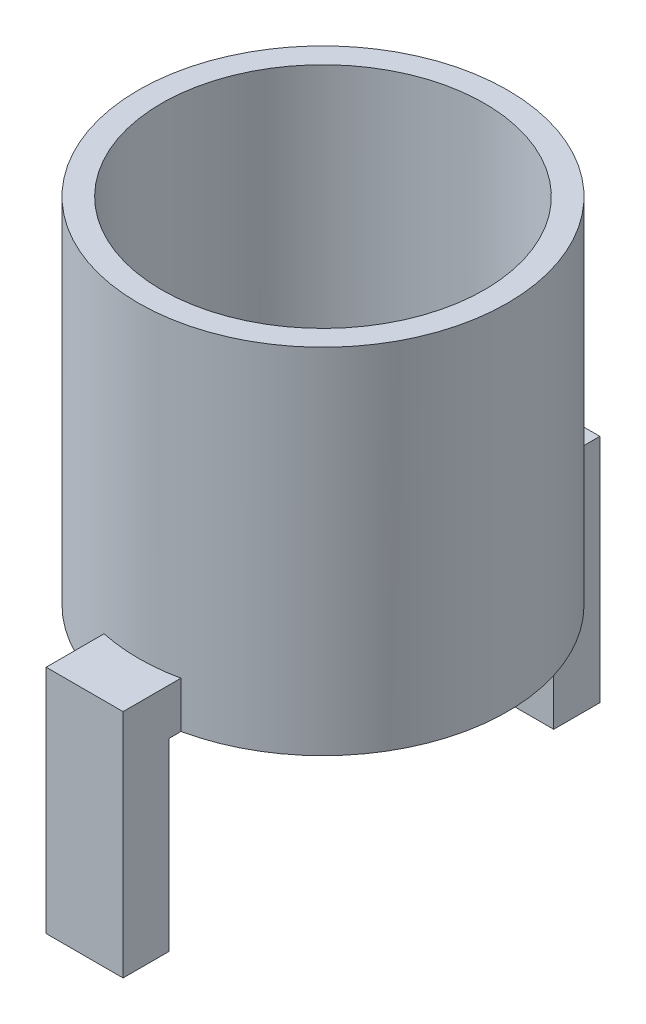
ISO-10303-21;
HEADER;
FILE_DESCRIPTION(('STEP AP214'),'2;1');
FILE_NAME('part.step','',(''),(''),'','','');
FILE_SCHEMA(('AUTOMOTIVE_DESIGN { 1 0 10303 214 1 1 1 1 }'));
ENDSEC;
DATA;
#1=APPLICATION_CONTEXT('core data for automotive mechanical design processes');
#2=APPLICATION_PROTOCOL_DEFINITION('international standard','automotive_design',2000,#1);
#3=PRODUCT_CONTEXT('',#1,'mechanical');
#4=PRODUCT('Part','Part','',(#3));
#5=PRODUCT_RELATED_PRODUCT_CATEGORY('part','',(#4));
#6=PRODUCT_DEFINITION_FORMATION('','',#4);
#7=PRODUCT_DEFINITION_CONTEXT('part definition',#1,'design');
#8=PRODUCT_DEFINITION('design','',#6,#7);
#9=PRODUCT_DEFINITION_SHAPE('','',#8);
#10=(LENGTH_UNIT() NAMED_UNIT(*) SI_UNIT(.MILLI.,.METRE.));
#11=(NAMED_UNIT(*) PLANE_ANGLE_UNIT() SI_UNIT($,.RADIAN.));
#12=(NAMED_UNIT(*) SI_UNIT($,.STERADIAN.) SOLID_ANGLE_UNIT());
#13=UNCERTAINTY_MEASURE_WITH_UNIT(LENGTH_MEASURE(1.E-05),#10,'distance_accuracy_value','');
#14=(GEOMETRIC_REPRESENTATION_CONTEXT(3) GLOBAL_UNCERTAINTY_ASSIGNED_CONTEXT((#13)) GLOBAL_UNIT_ASSIGNED_CONTEXT((#10,
#11,#12)) REPRESENTATION_CONTEXT('',''));
#15=CARTESIAN_POINT('',(0.,0.,0.));
#16=DIRECTION('',(0.,0.,1.));
#17=DIRECTION('',(1.,0.,0.));
#18=AXIS2_PLACEMENT_3D('',#15,#16,#17);
#19=CARTESIAN_POINT('',(-2.5,15.,15.5));
#20=DIRECTION('',(1.,0.,0.));
#21=DIRECTION('',(0.,0.,-1.));
#22=AXIS2_PLACEMENT_3D('',#19,#20,#21);
#23=PLANE('',#22);
#24=DIRECTION('',(0.,0.,-1.));
#25=VECTOR('',#24,1.);
#26=CARTESIAN_POINT('',(-2.5,11.995167951052,15.5));
#27=LINE('',#26,#25);
#28=CARTESIAN_POINT('',(-2.5,11.995167951052,-10.1980390271856));
#29=VERTEX_POINT('',#28);
#30=CARTESIAN_POINT('',(-2.5,11.995167951052,-12.5));
#31=VERTEX_POINT('',#30);
#32=EDGE_CURVE('E250',#29,#31,#27,.T.);
#33=ORIENTED_EDGE('',*,*,#32,.F.);
#34=DIRECTION('',(0.,1.,0.));
#35=VECTOR('',#34,1.);
#36=CARTESIAN_POINT('',(-2.5,10.,-10.1980390271856));
#37=LINE('',#36,#35);
#38=CARTESIAN_POINT('',(-2.5,12.,-10.1980390271856));
#39=VERTEX_POINT('',#38);
#40=EDGE_CURVE('E334',#29,#39,#37,.T.);
#41=ORIENTED_EDGE('',*,*,#40,.T.);
#42=DIRECTION('',(0.,0.,1.));
#43=VECTOR('',#42,1.);
#44=CARTESIAN_POINT('',(-2.5,12.,15.5));
#45=LINE('',#44,#43);
#46=CARTESIAN_POINT('',(-2.5,12.,-11.7366945943055));
#47=VERTEX_POINT('',#46);
#48=EDGE_CURVE('E206',#47,#39,#45,.T.);
#49=ORIENTED_EDGE('',*,*,#48,.F.);
#50=DIRECTION('',(0.,1.,0.));
#51=VECTOR('',#50,1.);
#52=CARTESIAN_POINT('',(-2.5,12.,-11.7366945943055));
#53=LINE('',#52,#51);
#54=CARTESIAN_POINT('',(-2.5,15.,-11.7366945943055));
#55=VERTEX_POINT('',#54);
#56=EDGE_CURVE('E203',#47,#55,#53,.T.);
#57=ORIENTED_EDGE('',*,*,#56,.T.);
#58=DIRECTION('',(0.,0.,1.));
#59=VECTOR('',#58,1.);
#60=CARTESIAN_POINT('',(-2.5,15.,15.5));
#61=LINE('',#60,#59);
#62=CARTESIAN_POINT('',(-2.5,15.,-15.5));
#63=VERTEX_POINT('',#62);
#64=EDGE_CURVE('E256',#63,#55,#61,.T.);
#65=ORIENTED_EDGE('',*,*,#64,.F.);
#66=DIRECTION('',(0.,-1.,0.));
#67=VECTOR('',#66,1.);
#68=CARTESIAN_POINT('',(-2.5,15.,-15.5));
#69=LINE('',#68,#67);
#70=CARTESIAN_POINT('',(-2.5,0.,-15.5));
#71=VERTEX_POINT('',#70);
#72=EDGE_CURVE('E214',#63,#71,#69,.T.);
#73=ORIENTED_EDGE('',*,*,#72,.T.);
#74=DIRECTION('',(0.,0.,1.));
#75=VECTOR('',#74,1.);
#76=CARTESIAN_POINT('',(-2.5,0.,-12.5));
#77=LINE('',#76,#75);
#78=CARTESIAN_POINT('',(-2.5,0.,-12.5));
#79=VERTEX_POINT('',#78);
#80=EDGE_CURVE('E229',#71,#79,#77,.T.);
#81=ORIENTED_EDGE('',*,*,#80,.T.);
#82=DIRECTION('',(0.,-1.,0.));
#83=VECTOR('',#82,1.);
#84=CARTESIAN_POINT('',(-2.5,15.,-12.5));
#85=LINE('',#84,#83);
#86=EDGE_CURVE('E218',#31,#79,#85,.T.);
#87=ORIENTED_EDGE('',*,*,#86,.F.);
#88=EDGE_LOOP('',(#33,#41,#49,#57,#65,#73,#81,#87));
#89=FACE_BOUND('',#88,.T.);
#90=ADVANCED_FACE('F45',(#89),#23,.F.);
#91=CARTESIAN_POINT('',(2.5,15.,15.5));
#92=DIRECTION('',(-1.,0.,0.));
#93=DIRECTION('',(0.,0.,1.));
#94=AXIS2_PLACEMENT_3D('',#91,#92,#93);
#95=PLANE('',#94);
#96=DIRECTION('',(0.,0.,-1.));
#97=VECTOR('',#96,1.);
#98=CARTESIAN_POINT('',(2.5,11.995167951052,15.5));
#99=LINE('',#98,#97);
#100=CARTESIAN_POINT('',(2.5,11.995167951052,12.5));
#101=VERTEX_POINT('',#100);
#102=CARTESIAN_POINT('',(2.5,11.995167951052,10.1980390271856));
#103=VERTEX_POINT('',#102);
#104=EDGE_CURVE('E174',#101,#103,#99,.T.);
#105=ORIENTED_EDGE('',*,*,#104,.T.);
#106=DIRECTION('',(0.,1.,0.));
#107=VECTOR('',#106,1.);
#108=CARTESIAN_POINT('',(2.5,10.,10.1980390271856));
#109=LINE('',#108,#107);
#110=CARTESIAN_POINT('',(2.5,12.,10.1980390271856));
#111=VERTEX_POINT('',#110);
#112=EDGE_CURVE('E161',#103,#111,#109,.T.);
#113=ORIENTED_EDGE('',*,*,#112,.T.);
#114=DIRECTION('',(0.,0.,-1.));
#115=VECTOR('',#114,1.);
#116=CARTESIAN_POINT('',(2.5,12.,15.5));
#117=LINE('',#116,#115);
#118=CARTESIAN_POINT('',(2.5,12.,11.7366945943055));
#119=VERTEX_POINT('',#118);
#120=EDGE_CURVE('E11',#119,#111,#117,.T.);
#121=ORIENTED_EDGE('',*,*,#120,.F.);
#122=DIRECTION('',(0.,1.,0.));
#123=VECTOR('',#122,1.);
#124=CARTESIAN_POINT('',(2.5,12.,11.7366945943055));
#125=LINE('',#124,#123);
#126=CARTESIAN_POINT('',(2.5,15.,11.7366945943055));
#127=VERTEX_POINT('',#126);
#128=EDGE_CURVE('E186',#119,#127,#125,.T.);
#129=ORIENTED_EDGE('',*,*,#128,.T.);
#130=DIRECTION('',(0.,0.,-1.));
#131=VECTOR('',#130,1.);
#132=CARTESIAN_POINT('',(2.5,15.,15.5));
#133=LINE('',#132,#131);
#134=CARTESIAN_POINT('',(2.5,15.,15.5));
#135=VERTEX_POINT('',#134);
#136=EDGE_CURVE('E265',#135,#127,#133,.T.);
#137=ORIENTED_EDGE('',*,*,#136,.F.);
#138=DIRECTION('',(0.,-1.,0.));
#139=VECTOR('',#138,1.);
#140=CARTESIAN_POINT('',(2.5,15.,15.5));
#141=LINE('',#140,#139);
#142=CARTESIAN_POINT('',(2.5,0.,15.5));
#143=VERTEX_POINT('',#142);
#144=EDGE_CURVE('E289',#135,#143,#141,.T.);
#145=ORIENTED_EDGE('',*,*,#144,.T.);
#146=DIRECTION('',(0.,0.,-1.));
#147=VECTOR('',#146,1.);
#148=CARTESIAN_POINT('',(2.5,0.,15.5));
#149=LINE('',#148,#147);
#150=CARTESIAN_POINT('',(2.5,0.,12.5));
#151=VERTEX_POINT('',#150);
#152=EDGE_CURVE('E276',#143,#151,#149,.T.);
#153=ORIENTED_EDGE('',*,*,#152,.T.);
#154=DIRECTION('',(0.,-1.,0.));
#155=VECTOR('',#154,1.);
#156=CARTESIAN_POINT('',(2.5,15.,12.5));
#157=LINE('',#156,#155);
#158=EDGE_CURVE('E286',#101,#151,#157,.T.);
#159=ORIENTED_EDGE('',*,*,#158,.F.);
#160=EDGE_LOOP('',(#105,#113,#121,#129,#137,#145,#153,#159));
#161=FACE_BOUND('',#160,.T.);
#162=ADVANCED_FACE('F170',(#161),#95,.F.);
#163=CARTESIAN_POINT('',(-2.5,11.995167951052,15.5));
#164=DIRECTION('',(0.,1.,0.));
#165=DIRECTION('',(0.,0.,1.));
#166=AXIS2_PLACEMENT_3D('',#163,#164,#165);
#167=PLANE('',#166);
#168=CARTESIAN_POINT('',(2.5,11.995167951052,-10.1980390271856));
#169=VERTEX_POINT('',#168);
#170=CARTESIAN_POINT('',(2.5,11.995167951052,-12.5));
#171=VERTEX_POINT('',#170);
#172=EDGE_CURVE('E247',#169,#171,#99,.T.);
#173=ORIENTED_EDGE('',*,*,#172,.F.);
#174=CARTESIAN_POINT('',(0.,11.995167951052,0.));
#175=DIRECTION('',(0.,1.,0.));
#176=DIRECTION('',(0.,0.,1.));
#177=AXIS2_PLACEMENT_3D('',#174,#175,#176);
#178=CIRCLE('',#177,10.5);
#179=EDGE_CURVE('E331',#169,#29,#178,.T.);
#180=ORIENTED_EDGE('',*,*,#179,.T.);
#181=ORIENTED_EDGE('',*,*,#32,.T.);
#182=DIRECTION('',(1.,0.,0.));
#183=VECTOR('',#182,1.);
#184=CARTESIAN_POINT('',(-2.5,11.995167951052,-12.5));
#185=LINE('',#184,#183);
#186=EDGE_CURVE('E240',#31,#171,#185,.T.);
#187=ORIENTED_EDGE('',*,*,#186,.T.);
#188=EDGE_LOOP('',(#173,#180,#181,#187));
#189=FACE_BOUND('',#188,.T.);
#190=ADVANCED_FACE('F329',(#189),#167,.F.);
#191=CARTESIAN_POINT('',(0.,15.,0.));
#192=DIRECTION('',(0.,1.,0.));
#193=DIRECTION('',(0.,0.,1.));
#194=AXIS2_PLACEMENT_3D('',#191,#192,#193);
#195=PLANE('',#194);
#196=CARTESIAN_POINT('',(0.,15.,0.));
#197=DIRECTION('',(0.,1.,0.));
#198=DIRECTION('',(0.,0.,1.));
#199=AXIS2_PLACEMENT_3D('',#196,#197,#198);
#200=CIRCLE('',#199,12.);
#201=CARTESIAN_POINT('',(2.5,15.,-11.7366945943055));
#202=VERTEX_POINT('',#201);
#203=EDGE_CURVE('E300',#202,#55,#200,.T.);
#204=ORIENTED_EDGE('',*,*,#203,.F.);
#205=CARTESIAN_POINT('',(2.5,15.,-15.5));
#206=VERTEX_POINT('',#205);
#207=EDGE_CURVE('E264',#202,#206,#133,.T.);
#208=ORIENTED_EDGE('',*,*,#207,.T.);
#209=DIRECTION('',(-1.,0.,0.));
#210=VECTOR('',#209,1.);
#211=CARTESIAN_POINT('',(-2.5,15.,-15.5));
#212=LINE('',#211,#210);
#213=EDGE_CURVE('E224',#206,#63,#212,.T.);
#214=ORIENTED_EDGE('',*,*,#213,.T.);
#215=ORIENTED_EDGE('',*,*,#64,.T.);
#216=EDGE_LOOP('',(#204,#208,#214,#215));
#217=FACE_BOUND('',#216,.T.);
#218=ADVANCED_FACE('F309',(#217),#195,.T.);
#219=CARTESIAN_POINT('',(2.5,15.,12.5));
#220=DIRECTION('',(0.,0.,1.));
#221=DIRECTION('',(1.,0.,0.));
#222=AXIS2_PLACEMENT_3D('',#219,#220,#221);
#223=PLANE('',#222);
#224=DIRECTION('',(-1.,0.,0.));
#225=VECTOR('',#224,1.);
#226=CARTESIAN_POINT('',(2.5,11.995167951052,12.5));
#227=LINE('',#226,#225);
#228=CARTESIAN_POINT('',(-2.5,11.995167951052,12.5));
#229=VERTEX_POINT('',#228);
#230=EDGE_CURVE('E295',#101,#229,#227,.T.);
#231=ORIENTED_EDGE('',*,*,#230,.F.);
#232=ORIENTED_EDGE('',*,*,#158,.T.);
#233=DIRECTION('',(-1.,0.,0.));
#234=VECTOR('',#233,1.);
#235=CARTESIAN_POINT('',(2.5,0.,12.5));
#236=LINE('',#235,#234);
#237=CARTESIAN_POINT('',(-2.5,0.,12.5));
#238=VERTEX_POINT('',#237);
#239=EDGE_CURVE('E280',#151,#238,#236,.T.);
#240=ORIENTED_EDGE('',*,*,#239,.T.);
#241=DIRECTION('',(0.,-1.,0.));
#242=VECTOR('',#241,1.);
#243=CARTESIAN_POINT('',(-2.5,15.,12.5));
#244=LINE('',#243,#242);
#245=EDGE_CURVE('E268',#229,#238,#244,.T.);
#246=ORIENTED_EDGE('',*,*,#245,.F.);
#247=EDGE_LOOP('',(#231,#232,#240,#246));
#248=FACE_BOUND('',#247,.T.);
#249=ADVANCED_FACE('F362',(#248),#223,.F.);
#250=CARTESIAN_POINT('',(-2.5,12.,10.1980390271856));
#251=VERTEX_POINT('',#250);
#252=CARTESIAN_POINT('',(-2.5,12.,11.7366945943055));
#253=VERTEX_POINT('',#252);
#254=EDGE_CURVE('E69',#251,#253,#45,.T.);
#255=ORIENTED_EDGE('',*,*,#254,.F.);
#256=DIRECTION('',(0.,1.,0.));
#257=VECTOR('',#256,1.);
#258=CARTESIAN_POINT('',(-2.5,10.,10.1980390271856));
#259=LINE('',#258,#257);
#260=CARTESIAN_POINT('',(-2.5,11.995167951052,10.1980390271856));
#261=VERTEX_POINT('',#260);
#262=EDGE_CURVE('E375',#251,#261,#259,.F.);
#263=ORIENTED_EDGE('',*,*,#262,.T.);
#264=EDGE_CURVE('E251',#229,#261,#27,.T.);
#265=ORIENTED_EDGE('',*,*,#264,.F.);
#266=ORIENTED_EDGE('',*,*,#245,.T.);
#267=DIRECTION('',(0.,0.,1.));
#268=VECTOR('',#267,1.);
#269=CARTESIAN_POINT('',(-2.5,0.,15.5));
#270=LINE('',#269,#268);
#271=CARTESIAN_POINT('',(-2.5,0.,15.5));
#272=VERTEX_POINT('',#271);
#273=EDGE_CURVE('E255',#238,#272,#270,.T.);
#274=ORIENTED_EDGE('',*,*,#273,.T.);
#275=DIRECTION('',(0.,-1.,0.));
#276=VECTOR('',#275,1.);
#277=CARTESIAN_POINT('',(-2.5,15.,15.5));
#278=LINE('',#277,#276);
#279=CARTESIAN_POINT('',(-2.5,15.,15.5));
#280=VERTEX_POINT('',#279);
#281=EDGE_CURVE('E292',#280,#272,#278,.T.);
#282=ORIENTED_EDGE('',*,*,#281,.F.);
#283=CARTESIAN_POINT('',(-2.5,15.,11.7366945943055));
#284=VERTEX_POINT('',#283);
#285=EDGE_CURVE('E261',#284,#280,#61,.T.);
#286=ORIENTED_EDGE('',*,*,#285,.F.);
#287=DIRECTION('',(0.,1.,0.));
#288=VECTOR('',#287,1.);
#289=CARTESIAN_POINT('',(-2.5,12.,11.7366945943055));
#290=LINE('',#289,#288);
#291=EDGE_CURVE('E191',#284,#253,#290,.F.);
#292=ORIENTED_EDGE('',*,*,#291,.T.);
#293=EDGE_LOOP('',(#255,#263,#265,#266,#274,#282,#286,#292));
#294=FACE_BOUND('',#293,.T.);
#295=ADVANCED_FACE('F47',(#294),#23,.F.);
#296=CARTESIAN_POINT('',(2.5,15.,15.5));
#297=DIRECTION('',(0.,0.,-1.));
#298=DIRECTION('',(-1.,0.,0.));
#299=AXIS2_PLACEMENT_3D('',#296,#297,#298);
#300=PLANE('',#299);
#301=ORIENTED_EDGE('',*,*,#281,.T.);
#302=DIRECTION('',(1.,0.,0.));
#303=VECTOR('',#302,1.);
#304=CARTESIAN_POINT('',(2.5,0.,15.5));
#305=LINE('',#304,#303);
#306=EDGE_CURVE('E272',#272,#143,#305,.T.);
#307=ORIENTED_EDGE('',*,*,#306,.T.);
#308=ORIENTED_EDGE('',*,*,#144,.F.);
#309=DIRECTION('',(1.,0.,0.));
#310=VECTOR('',#309,1.);
#311=CARTESIAN_POINT('',(2.5,15.,15.5));
#312=LINE('',#311,#310);
#313=EDGE_CURVE('E260',#280,#135,#312,.T.);
#314=ORIENTED_EDGE('',*,*,#313,.F.);
#315=EDGE_LOOP('',(#301,#307,#308,#314));
#316=FACE_BOUND('',#315,.T.);
#317=ADVANCED_FACE('F361',(#316),#300,.F.);
#318=CARTESIAN_POINT('',(2.5,12.,-10.1980390271856));
#319=VERTEX_POINT('',#318);
#320=CARTESIAN_POINT('',(2.5,12.,-11.7366945943055));
#321=VERTEX_POINT('',#320);
#322=EDGE_CURVE('E54',#319,#321,#117,.T.);
#323=ORIENTED_EDGE('',*,*,#322,.F.);
#324=DIRECTION('',(0.,1.,0.));
#325=VECTOR('',#324,1.);
#326=CARTESIAN_POINT('',(2.5,10.,-10.1980390271856));
#327=LINE('',#326,#325);
#328=EDGE_CURVE('E61',#319,#169,#327,.F.);
#329=ORIENTED_EDGE('',*,*,#328,.T.);
#330=ORIENTED_EDGE('',*,*,#172,.T.);
#331=DIRECTION('',(0.,-1.,0.));
#332=VECTOR('',#331,1.);
#333=CARTESIAN_POINT('',(2.5,15.,-12.5));
#334=LINE('',#333,#332);
#335=CARTESIAN_POINT('',(2.5,0.,-12.5));
#336=VERTEX_POINT('',#335);
#337=EDGE_CURVE('E221',#171,#336,#334,.T.);
#338=ORIENTED_EDGE('',*,*,#337,.T.);
#339=DIRECTION('',(0.,0.,-1.));
#340=VECTOR('',#339,1.);
#341=CARTESIAN_POINT('',(2.5,0.,-12.5));
#342=LINE('',#341,#340);
#343=CARTESIAN_POINT('',(2.5,0.,-15.5));
#344=VERTEX_POINT('',#343);
#345=EDGE_CURVE('E236',#336,#344,#342,.T.);
#346=ORIENTED_EDGE('',*,*,#345,.T.);
#347=DIRECTION('',(0.,-1.,0.));
#348=VECTOR('',#347,1.);
#349=CARTESIAN_POINT('',(2.5,15.,-15.5));
#350=LINE('',#349,#348);
#351=EDGE_CURVE('E210',#206,#344,#350,.T.);
#352=ORIENTED_EDGE('',*,*,#351,.F.);
#353=ORIENTED_EDGE('',*,*,#207,.F.);
#354=DIRECTION('',(0.,1.,0.));
#355=VECTOR('',#354,1.);
#356=CARTESIAN_POINT('',(2.5,12.,-11.7366945943055));
#357=LINE('',#356,#355);
#358=EDGE_CURVE('E200',#202,#321,#357,.F.);
#359=ORIENTED_EDGE('',*,*,#358,.T.);
#360=EDGE_LOOP('',(#323,#329,#330,#338,#346,#352,#353,#359));
#361=FACE_BOUND('',#360,.T.);
#362=ADVANCED_FACE('F313',(#361),#95,.F.);
#363=EDGE_CURVE('E297',#284,#127,#200,.T.);
#364=ORIENTED_EDGE('',*,*,#363,.F.);
#365=ORIENTED_EDGE('',*,*,#285,.T.);
#366=ORIENTED_EDGE('',*,*,#313,.T.);
#367=ORIENTED_EDGE('',*,*,#136,.T.);
#368=EDGE_LOOP('',(#364,#365,#366,#367));
#369=FACE_BOUND('',#368,.T.);
#370=ADVANCED_FACE('F442',(#369),#195,.T.);
#371=CARTESIAN_POINT('',(0.,0.,0.));
#372=DIRECTION('',(0.,1.,0.));
#373=DIRECTION('',(0.,0.,1.));
#374=AXIS2_PLACEMENT_3D('',#371,#372,#373);
#375=PLANE('',#374);
#376=ORIENTED_EDGE('',*,*,#273,.F.);
#377=ORIENTED_EDGE('',*,*,#239,.F.);
#378=ORIENTED_EDGE('',*,*,#152,.F.);
#379=ORIENTED_EDGE('',*,*,#306,.F.);
#380=EDGE_LOOP('',(#376,#377,#378,#379));
#381=FACE_BOUND('',#380,.T.);
#382=ADVANCED_FACE('F350',(#381),#375,.F.);
#383=ORIENTED_EDGE('',*,*,#264,.T.);
#384=EDGE_CURVE('E176',#261,#103,#178,.T.);
#385=ORIENTED_EDGE('',*,*,#384,.T.);
#386=ORIENTED_EDGE('',*,*,#104,.F.);
#387=ORIENTED_EDGE('',*,*,#230,.T.);
#388=EDGE_LOOP('',(#383,#385,#386,#387));
#389=FACE_BOUND('',#388,.T.);
#390=ADVANCED_FACE('F342',(#389),#167,.F.);
#391=CARTESIAN_POINT('',(-2.5,15.,-15.5));
#392=DIRECTION('',(0.,0.,1.));
#393=DIRECTION('',(1.,0.,0.));
#394=AXIS2_PLACEMENT_3D('',#391,#392,#393);
#395=PLANE('',#394);
#396=DIRECTION('',(-1.,0.,0.));
#397=VECTOR('',#396,1.);
#398=CARTESIAN_POINT('',(-2.5,0.,-15.5));
#399=LINE('',#398,#397);
#400=EDGE_CURVE('E233',#344,#71,#399,.T.);
#401=ORIENTED_EDGE('',*,*,#400,.T.);
#402=ORIENTED_EDGE('',*,*,#72,.F.);
#403=ORIENTED_EDGE('',*,*,#213,.F.);
#404=ORIENTED_EDGE('',*,*,#351,.T.);
#405=EDGE_LOOP('',(#401,#402,#403,#404));
#406=FACE_BOUND('',#405,.T.);
#407=ADVANCED_FACE('F340',(#406),#395,.F.);
#408=CARTESIAN_POINT('',(-2.5,15.,-12.5));
#409=DIRECTION('',(0.,0.,-1.));
#410=DIRECTION('',(-1.,0.,0.));
#411=AXIS2_PLACEMENT_3D('',#408,#409,#410);
#412=PLANE('',#411);
#413=ORIENTED_EDGE('',*,*,#186,.F.);
#414=ORIENTED_EDGE('',*,*,#86,.T.);
#415=DIRECTION('',(1.,0.,0.));
#416=VECTOR('',#415,1.);
#417=CARTESIAN_POINT('',(-2.5,0.,-12.5));
#418=LINE('',#417,#416);
#419=EDGE_CURVE('E225',#79,#336,#418,.T.);
#420=ORIENTED_EDGE('',*,*,#419,.T.);
#421=ORIENTED_EDGE('',*,*,#337,.F.);
#422=EDGE_LOOP('',(#413,#414,#420,#421));
#423=FACE_BOUND('',#422,.T.);
#424=ADVANCED_FACE('F325',(#423),#412,.F.);
#425=CARTESIAN_POINT('',(0.,0.,0.));
#426=DIRECTION('',(0.,-1.,0.));
#427=DIRECTION('',(0.,0.,-1.));
#428=AXIS2_PLACEMENT_3D('',#425,#426,#427);
#429=PLANE('',#428);
#430=ORIENTED_EDGE('',*,*,#345,.F.);
#431=ORIENTED_EDGE('',*,*,#419,.F.);
#432=ORIENTED_EDGE('',*,*,#80,.F.);
#433=ORIENTED_EDGE('',*,*,#400,.F.);
#434=EDGE_LOOP('',(#430,#431,#432,#433));
#435=FACE_BOUND('',#434,.T.);
#436=ADVANCED_FACE('F338',(#435),#429,.T.);
#437=CARTESIAN_POINT('',(0.,12.,0.));
#438=DIRECTION('',(0.,1.,0.));
#439=DIRECTION('',(0.,0.,1.));
#440=AXIS2_PLACEMENT_3D('',#437,#438,#439);
#441=PLANE('',#440);
#442=ORIENTED_EDGE('',*,*,#48,.T.);
#443=CARTESIAN_POINT('',(0.,12.,0.));
#444=DIRECTION('',(0.,1.,0.));
#445=DIRECTION('',(0.,0.,1.));
#446=AXIS2_PLACEMENT_3D('',#443,#444,#445);
#447=CIRCLE('',#446,10.5);
#448=EDGE_CURVE('E379',#39,#251,#447,.T.);
#449=ORIENTED_EDGE('',*,*,#448,.T.);
#450=ORIENTED_EDGE('',*,*,#254,.T.);
#451=CARTESIAN_POINT('',(0.,12.,0.));
#452=DIRECTION('',(0.,1.,0.));
#453=DIRECTION('',(0.,0.,1.));
#454=AXIS2_PLACEMENT_3D('',#451,#452,#453);
#455=CIRCLE('',#454,12.);
#456=EDGE_CURVE('E187',#47,#253,#455,.T.);
#457=ORIENTED_EDGE('',*,*,#456,.F.);
#458=EDGE_LOOP('',(#442,#449,#450,#457));
#459=FACE_BOUND('',#458,.T.);
#460=ADVANCED_FACE('F378',(#459),#441,.F.);
#461=ORIENTED_EDGE('',*,*,#120,.T.);
#462=CARTESIAN_POINT('',(0.,12.,0.));
#463=DIRECTION('',(0.,1.,0.));
#464=DIRECTION('',(0.,0.,1.));
#465=AXIS2_PLACEMENT_3D('',#462,#463,#464);
#466=CIRCLE('',#465,10.5);
#467=EDGE_CURVE('E158',#111,#319,#466,.T.);
#468=ORIENTED_EDGE('',*,*,#467,.T.);
#469=ORIENTED_EDGE('',*,*,#322,.T.);
#470=EDGE_CURVE('E181',#119,#321,#455,.T.);
#471=ORIENTED_EDGE('',*,*,#470,.F.);
#472=EDGE_LOOP('',(#461,#468,#469,#471));
#473=FACE_BOUND('',#472,.T.);
#474=ADVANCED_FACE('F179',(#473),#441,.F.);
#475=CARTESIAN_POINT('',(0.,12.,0.));
#476=DIRECTION('',(0.,1.,0.));
#477=DIRECTION('',(0.,0.,1.));
#478=AXIS2_PLACEMENT_3D('',#475,#476,#477);
#479=CYLINDRICAL_SURFACE('',#478,12.);
#480=CARTESIAN_POINT('',(0.,35.,0.));
#481=DIRECTION('',(0.,1.,0.));
#482=DIRECTION('',(0.,0.,1.));
#483=AXIS2_PLACEMENT_3D('',#480,#481,#482);
#484=CIRCLE('',#483,12.);
#485=CARTESIAN_POINT('',(0.,35.,12.));
#486=VERTEX_POINT('',#485);
#487=EDGE_CURVE('E194',#486,#486,#484,.T.);
#488=ORIENTED_EDGE('',*,*,#487,.F.);
#489=EDGE_LOOP('',(#488));
#490=FACE_BOUND('',#489,.T.);
#491=ORIENTED_EDGE('',*,*,#56,.F.);
#492=ORIENTED_EDGE('',*,*,#456,.T.);
#493=ORIENTED_EDGE('',*,*,#291,.F.);
#494=ORIENTED_EDGE('',*,*,#363,.T.);
#495=ORIENTED_EDGE('',*,*,#128,.F.);
#496=ORIENTED_EDGE('',*,*,#470,.T.);
#497=ORIENTED_EDGE('',*,*,#358,.F.);
#498=ORIENTED_EDGE('',*,*,#203,.T.);
#499=EDGE_LOOP('',(#491,#492,#493,#494,#495,#496,#497,#498));
#500=FACE_BOUND('',#499,.T.);
#501=ADVANCED_FACE('F306',(#490,#500),#479,.T.);
#502=CARTESIAN_POINT('',(0.,35.,0.));
#503=DIRECTION('',(0.,1.,0.));
#504=DIRECTION('',(0.,0.,1.));
#505=AXIS2_PLACEMENT_3D('',#502,#503,#504);
#506=PLANE('',#505);
#507=CARTESIAN_POINT('',(0.,35.,0.));
#508=DIRECTION('',(0.,1.,0.));
#509=DIRECTION('',(0.,0.,1.));
#510=AXIS2_PLACEMENT_3D('',#507,#508,#509);
#511=CIRCLE('',#510,10.5);
#512=CARTESIAN_POINT('',(0.,35.,10.5));
#513=VERTEX_POINT('',#512);
#514=EDGE_CURVE('E166',#513,#513,#511,.T.);
#515=ORIENTED_EDGE('',*,*,#514,.F.);
#516=EDGE_LOOP('',(#515));
#517=FACE_BOUND('',#516,.T.);
#518=ORIENTED_EDGE('',*,*,#487,.T.);
#519=EDGE_LOOP('',(#518));
#520=FACE_BOUND('',#519,.T.);
#521=ADVANCED_FACE('F397',(#517,#520),#506,.T.);
#522=CARTESIAN_POINT('',(0.,10.,0.));
#523=DIRECTION('',(0.,1.,0.));
#524=DIRECTION('',(0.,0.,1.));
#525=AXIS2_PLACEMENT_3D('',#522,#523,#524);
#526=CYLINDRICAL_SURFACE('',#525,10.5);
#527=ORIENTED_EDGE('',*,*,#514,.T.);
#528=EDGE_LOOP('',(#527));
#529=FACE_BOUND('',#528,.T.);
#530=ORIENTED_EDGE('',*,*,#40,.F.);
#531=ORIENTED_EDGE('',*,*,#179,.F.);
#532=ORIENTED_EDGE('',*,*,#328,.F.);
#533=ORIENTED_EDGE('',*,*,#467,.F.);
#534=ORIENTED_EDGE('',*,*,#112,.F.);
#535=ORIENTED_EDGE('',*,*,#384,.F.);
#536=ORIENTED_EDGE('',*,*,#262,.F.);
#537=ORIENTED_EDGE('',*,*,#448,.F.);
#538=EDGE_LOOP('',(#530,#531,#532,#533,#534,#535,#536,#537));
#539=FACE_BOUND('',#538,.T.);
#540=ADVANCED_FACE('F160',(#529,#539),#526,.F.);
#541=CLOSED_SHELL('',(#90,#162,#190,#218,#249,#295,#317,#362,#370,#382,#390,#407,#424,#436,#460,
#474,#501,#521,#540));
#542=MANIFOLD_SOLID_BREP('B2',#541);
#543=ADVANCED_BREP_SHAPE_REPRESENTATION('',(#18,#542),#14);
#544=SHAPE_DEFINITION_REPRESENTATION(#9,#543);
ENDSEC;
END-ISO-10303-21;
